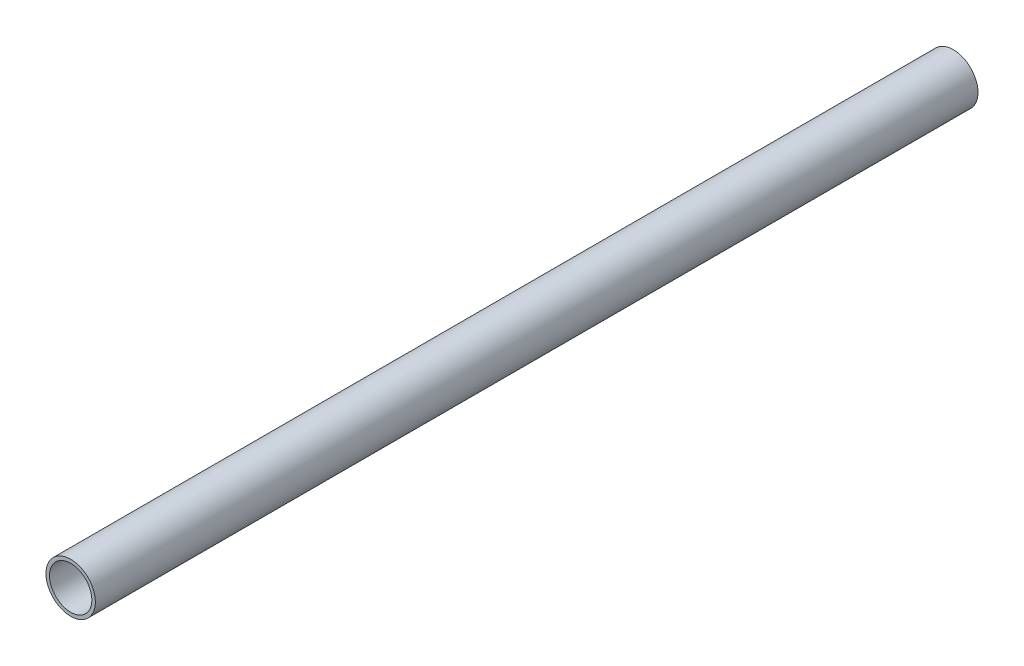
ISO-10303-21;
HEADER;
FILE_DESCRIPTION(('STEP AP214'),'2;1');
FILE_NAME('part.step','',(''),(''),'','','');
FILE_SCHEMA(('AUTOMOTIVE_DESIGN { 1 0 10303 214 1 1 1 1 }'));
ENDSEC;
DATA;
#1=APPLICATION_CONTEXT('core data for automotive mechanical design processes');
#2=APPLICATION_PROTOCOL_DEFINITION('international standard','automotive_design',2000,#1);
#3=PRODUCT_CONTEXT('',#1,'mechanical');
#4=PRODUCT('Part','Part','',(#3));
#5=PRODUCT_RELATED_PRODUCT_CATEGORY('part','',(#4));
#6=PRODUCT_DEFINITION_FORMATION('','',#4);
#7=PRODUCT_DEFINITION_CONTEXT('part definition',#1,'design');
#8=PRODUCT_DEFINITION('design','',#6,#7);
#9=PRODUCT_DEFINITION_SHAPE('','',#8);
#10=(LENGTH_UNIT() NAMED_UNIT(*) SI_UNIT(.MILLI.,.METRE.));
#11=(NAMED_UNIT(*) PLANE_ANGLE_UNIT() SI_UNIT($,.RADIAN.));
#12=(NAMED_UNIT(*) SI_UNIT($,.STERADIAN.) SOLID_ANGLE_UNIT());
#13=UNCERTAINTY_MEASURE_WITH_UNIT(LENGTH_MEASURE(1.E-05),#10,'distance_accuracy_value','');
#14=(GEOMETRIC_REPRESENTATION_CONTEXT(3) GLOBAL_UNCERTAINTY_ASSIGNED_CONTEXT((#13)) GLOBAL_UNIT_ASSIGNED_CONTEXT((#10,
#11,#12)) REPRESENTATION_CONTEXT('',''));
#15=CARTESIAN_POINT('',(0.,0.,0.));
#16=DIRECTION('',(0.,0.,1.));
#17=DIRECTION('',(1.,0.,0.));
#18=AXIS2_PLACEMENT_3D('',#15,#16,#17);
#19=CARTESIAN_POINT('',(0.,0.,250.));
#20=DIRECTION('',(0.,0.,1.));
#21=DIRECTION('',(1.,0.,0.));
#22=AXIS2_PLACEMENT_3D('',#19,#20,#21);
#23=PLANE('',#22);
#24=CARTESIAN_POINT('',(0.,0.,250.));
#25=DIRECTION('',(0.,0.,1.));
#26=DIRECTION('',(1.,0.,0.));
#27=AXIS2_PLACEMENT_3D('',#24,#25,#26);
#28=CIRCLE('',#27,7.);
#29=CARTESIAN_POINT('',(7.,0.,250.));
#30=VERTEX_POINT('',#29);
#31=EDGE_CURVE('E10',#30,#30,#28,.T.);
#32=ORIENTED_EDGE('',*,*,#31,.T.);
#33=EDGE_LOOP('',(#32));
#34=FACE_BOUND('',#33,.T.);
#35=CARTESIAN_POINT('',(0.,0.,250.));
#36=DIRECTION('',(0.,0.,1.));
#37=DIRECTION('',(1.,0.,0.));
#38=AXIS2_PLACEMENT_3D('',#35,#36,#37);
#39=CIRCLE('',#38,6.);
#40=CARTESIAN_POINT('',(6.,0.,250.));
#41=VERTEX_POINT('',#40);
#42=EDGE_CURVE('E52',#41,#41,#39,.T.);
#43=ORIENTED_EDGE('',*,*,#42,.F.);
#44=EDGE_LOOP('',(#43));
#45=FACE_BOUND('',#44,.T.);
#46=ADVANCED_FACE('F39',(#34,#45),#23,.T.);
#47=CARTESIAN_POINT('',(0.,0.,0.));
#48=DIRECTION('',(0.,0.,1.));
#49=DIRECTION('',(1.,0.,0.));
#50=AXIS2_PLACEMENT_3D('',#47,#48,#49);
#51=PLANE('',#50);
#52=CARTESIAN_POINT('',(0.,0.,0.));
#53=DIRECTION('',(0.,0.,1.));
#54=DIRECTION('',(1.,0.,0.));
#55=AXIS2_PLACEMENT_3D('',#52,#53,#54);
#56=CIRCLE('',#55,7.);
#57=CARTESIAN_POINT('',(7.,0.,0.));
#58=VERTEX_POINT('',#57);
#59=EDGE_CURVE('E43',#58,#58,#56,.T.);
#60=ORIENTED_EDGE('',*,*,#59,.F.);
#61=EDGE_LOOP('',(#60));
#62=FACE_BOUND('',#61,.T.);
#63=CARTESIAN_POINT('',(0.,0.,0.));
#64=DIRECTION('',(0.,0.,1.));
#65=DIRECTION('',(1.,0.,0.));
#66=AXIS2_PLACEMENT_3D('',#63,#64,#65);
#67=CIRCLE('',#66,6.);
#68=CARTESIAN_POINT('',(6.,0.,0.));
#69=VERTEX_POINT('',#68);
#70=EDGE_CURVE('E54',#69,#69,#67,.T.);
#71=ORIENTED_EDGE('',*,*,#70,.T.);
#72=EDGE_LOOP('',(#71));
#73=FACE_BOUND('',#72,.T.);
#74=ADVANCED_FACE('F66',(#62,#73),#51,.F.);
#75=CARTESIAN_POINT('',(0.,0.,250.));
#76=DIRECTION('',(0.,0.,-1.));
#77=DIRECTION('',(-1.,0.,0.));
#78=AXIS2_PLACEMENT_3D('',#75,#76,#77);
#79=CYLINDRICAL_SURFACE('',#78,7.);
#80=ORIENTED_EDGE('',*,*,#31,.F.);
#81=EDGE_LOOP('',(#80));
#82=FACE_BOUND('',#81,.T.);
#83=ORIENTED_EDGE('',*,*,#59,.T.);
#84=EDGE_LOOP('',(#83));
#85=FACE_BOUND('',#84,.T.);
#86=ADVANCED_FACE('F41',(#82,#85),#79,.T.);
#87=CARTESIAN_POINT('',(0.,0.,250.));
#88=DIRECTION('',(0.,0.,-1.));
#89=DIRECTION('',(-1.,0.,0.));
#90=AXIS2_PLACEMENT_3D('',#87,#88,#89);
#91=CYLINDRICAL_SURFACE('',#90,6.);
#92=ORIENTED_EDGE('',*,*,#42,.T.);
#93=EDGE_LOOP('',(#92));
#94=FACE_BOUND('',#93,.T.);
#95=ORIENTED_EDGE('',*,*,#70,.F.);
#96=EDGE_LOOP('',(#95));
#97=FACE_BOUND('',#96,.T.);
#98=ADVANCED_FACE('F62',(#94,#97),#91,.F.);
#99=CLOSED_SHELL('',(#46,#74,#86,#98));
#100=MANIFOLD_SOLID_BREP('B2',#99);
#101=ADVANCED_BREP_SHAPE_REPRESENTATION('',(#18,#100),#14);
#102=SHAPE_DEFINITION_REPRESENTATION(#9,#101);
ENDSEC;
END-ISO-10303-21;
